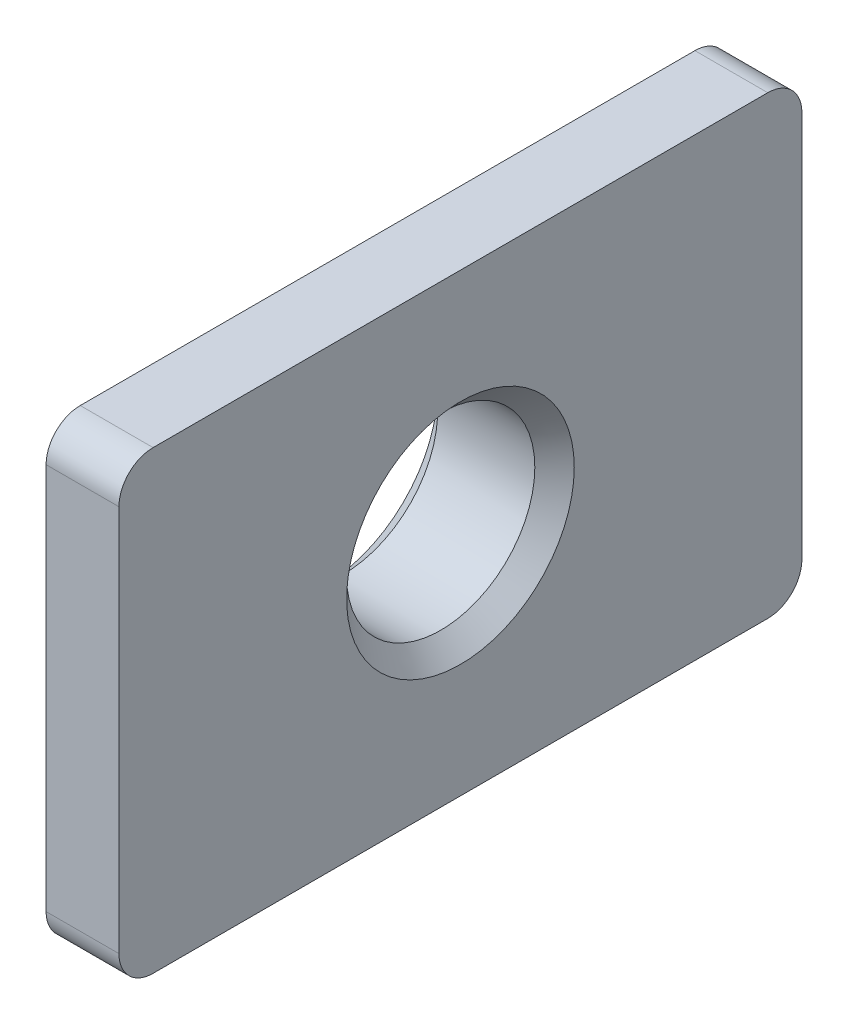
ISO-10303-21;
HEADER;
FILE_DESCRIPTION(('STEP AP214'),'2;1');
FILE_NAME('part.step','',(''),(''),'','','');
FILE_SCHEMA(('AUTOMOTIVE_DESIGN { 1 0 10303 214 1 1 1 1 }'));
ENDSEC;
DATA;
#1=APPLICATION_CONTEXT('core data for automotive mechanical design processes');
#2=APPLICATION_PROTOCOL_DEFINITION('international standard','automotive_design',2000,#1);
#3=PRODUCT_CONTEXT('',#1,'mechanical');
#4=PRODUCT('Part','Part','',(#3));
#5=PRODUCT_RELATED_PRODUCT_CATEGORY('part','',(#4));
#6=PRODUCT_DEFINITION_FORMATION('','',#4);
#7=PRODUCT_DEFINITION_CONTEXT('part definition',#1,'design');
#8=PRODUCT_DEFINITION('design','',#6,#7);
#9=PRODUCT_DEFINITION_SHAPE('','',#8);
#10=(LENGTH_UNIT() NAMED_UNIT(*) SI_UNIT(.MILLI.,.METRE.));
#11=(NAMED_UNIT(*) PLANE_ANGLE_UNIT() SI_UNIT($,.RADIAN.));
#12=(NAMED_UNIT(*) SI_UNIT($,.STERADIAN.) SOLID_ANGLE_UNIT());
#13=UNCERTAINTY_MEASURE_WITH_UNIT(LENGTH_MEASURE(1.E-05),#10,'distance_accuracy_value','');
#14=(GEOMETRIC_REPRESENTATION_CONTEXT(3) GLOBAL_UNCERTAINTY_ASSIGNED_CONTEXT((#13)) GLOBAL_UNIT_ASSIGNED_CONTEXT((#10,
#11,#12)) REPRESENTATION_CONTEXT('',''));
#15=CARTESIAN_POINT('',(0.,0.,0.));
#16=DIRECTION('',(0.,0.,1.));
#17=DIRECTION('',(1.,0.,0.));
#18=AXIS2_PLACEMENT_3D('',#15,#16,#17);
#19=CARTESIAN_POINT('',(-3.,-4.25,6.75));
#20=DIRECTION('',(1.,0.,0.));
#21=DIRECTION('',(0.,0.,-1.));
#22=AXIS2_PLACEMENT_3D('',#19,#20,#21);
#23=PLANE('',#22);
#24=CARTESIAN_POINT('',(-3.,0.,0.));
#25=DIRECTION('',(-1.,0.,0.));
#26=DIRECTION('',(0.,0.,1.));
#27=AXIS2_PLACEMENT_3D('',#24,#25,#26);
#28=CIRCLE('',#27,3.45);
#29=CARTESIAN_POINT('',(-3.,0.,3.45));
#30=VERTEX_POINT('',#29);
#31=EDGE_CURVE('E139',#30,#30,#28,.F.);
#32=ORIENTED_EDGE('',*,*,#31,.F.);
#33=EDGE_LOOP('',(#32));
#34=FACE_BOUND('',#33,.T.);
#35=CARTESIAN_POINT('',(-2.9999999999859,0.,0.));
#36=DIRECTION('',(-1.,0.,0.));
#37=DIRECTION('',(0.,0.,1.));
#38=AXIS2_PLACEMENT_3D('',#35,#36,#37);
#39=CIRCLE('',#38,2.50000000005457);
#40=CARTESIAN_POINT('',(-2.9999999999859,0.,2.50000000005457));
#41=VERTEX_POINT('',#40);
#42=EDGE_CURVE('E19',#41,#41,#39,.F.);
#43=ORIENTED_EDGE('',*,*,#42,.T.);
#44=EDGE_LOOP('',(#43));
#45=FACE_BOUND('',#44,.T.);
#46=ADVANCED_FACE('F16',(#34,#45),#23,.F.);
#47=CARTESIAN_POINT('',(-2.9999999999859,0.,0.));
#48=DIRECTION('',(-1.,0.,0.));
#49=DIRECTION('',(0.,0.,1.));
#50=AXIS2_PLACEMENT_3D('',#47,#48,#49);
#51=CONICAL_SURFACE('',#50,2.50000000005457,0.785398163397448);
#52=ORIENTED_EDGE('',*,*,#42,.F.);
#53=EDGE_LOOP('',(#52));
#54=FACE_BOUND('',#53,.T.);
#55=CARTESIAN_POINT('',(-2.567,0.,0.));
#56=DIRECTION('',(-1.,0.,0.));
#57=DIRECTION('',(0.,0.,1.));
#58=AXIS2_PLACEMENT_3D('',#55,#56,#57);
#59=CIRCLE('',#58,2.067);
#60=CARTESIAN_POINT('',(-2.567,0.,2.067));
#61=VERTEX_POINT('',#60);
#62=EDGE_CURVE('E86',#61,#61,#59,.F.);
#63=ORIENTED_EDGE('',*,*,#62,.T.);
#64=EDGE_LOOP('',(#63));
#65=FACE_BOUND('',#64,.T.);
#66=ADVANCED_FACE('F168',(#54,#65),#51,.F.);
#67=CARTESIAN_POINT('',(3.,0.,0.));
#68=DIRECTION('',(-1.,0.,0.));
#69=DIRECTION('',(0.,0.,1.));
#70=AXIS2_PLACEMENT_3D('',#67,#68,#69);
#71=CYLINDRICAL_SURFACE('',#70,3.45);
#72=ORIENTED_EDGE('',*,*,#31,.T.);
#73=EDGE_LOOP('',(#72));
#74=FACE_BOUND('',#73,.T.);
#75=CARTESIAN_POINT('',(-1.6,0.,0.));
#76=DIRECTION('',(-1.,0.,0.));
#77=DIRECTION('',(0.,0.,1.));
#78=AXIS2_PLACEMENT_3D('',#75,#76,#77);
#79=CIRCLE('',#78,3.45);
#80=CARTESIAN_POINT('',(-1.6,0.,3.45));
#81=VERTEX_POINT('',#80);
#82=EDGE_CURVE('E85',#81,#81,#79,.T.);
#83=ORIENTED_EDGE('',*,*,#82,.T.);
#84=EDGE_LOOP('',(#83));
#85=FACE_BOUND('',#84,.T.);
#86=ADVANCED_FACE('F171',(#74,#85),#71,.T.);
#87=CARTESIAN_POINT('',(0.,0.,0.));
#88=DIRECTION('',(-1.,0.,0.));
#89=DIRECTION('',(0.,0.,1.));
#90=AXIS2_PLACEMENT_3D('',#87,#88,#89);
#91=CYLINDRICAL_SURFACE('',#90,2.067);
#92=ORIENTED_EDGE('',*,*,#62,.F.);
#93=EDGE_LOOP('',(#92));
#94=FACE_BOUND('',#93,.T.);
#95=CARTESIAN_POINT('',(-0.432999999986805,0.,0.));
#96=DIRECTION('',(1.,0.,0.));
#97=DIRECTION('',(0.,0.,-1.));
#98=AXIS2_PLACEMENT_3D('',#95,#96,#97);
#99=CIRCLE('',#98,2.06700000001092);
#100=CARTESIAN_POINT('',(-0.432999999986805,0.,-2.06700000001092));
#101=VERTEX_POINT('',#100);
#102=EDGE_CURVE('E95',#101,#101,#99,.T.);
#103=ORIENTED_EDGE('',*,*,#102,.T.);
#104=EDGE_LOOP('',(#103));
#105=FACE_BOUND('',#104,.T.);
#106=ADVANCED_FACE('F174',(#94,#105),#91,.F.);
#107=CARTESIAN_POINT('',(-1.6,3.45,0.));
#108=DIRECTION('',(1.,0.,0.));
#109=DIRECTION('',(0.,0.,-1.));
#110=AXIS2_PLACEMENT_3D('',#107,#108,#109);
#111=PLANE('',#110);
#112=ORIENTED_EDGE('',*,*,#82,.F.);
#113=EDGE_LOOP('',(#112));
#114=FACE_BOUND('',#113,.T.);
#115=CARTESIAN_POINT('',(-1.6,4.25,-6.75));
#116=DIRECTION('',(-1.,0.,0.));
#117=DIRECTION('',(0.,0.,1.));
#118=AXIS2_PLACEMENT_3D('',#115,#116,#117);
#119=CIRCLE('',#118,0.75);
#120=CARTESIAN_POINT('',(-1.6,4.25,-7.5));
#121=VERTEX_POINT('',#120);
#122=CARTESIAN_POINT('',(-1.6,5.,-6.75));
#123=VERTEX_POINT('',#122);
#124=EDGE_CURVE('E113',#121,#123,#119,.F.);
#125=ORIENTED_EDGE('',*,*,#124,.F.);
#126=DIRECTION('',(0.,1.,0.));
#127=VECTOR('',#126,1.);
#128=CARTESIAN_POINT('',(-1.6,-4.25,-7.5));
#129=LINE('',#128,#127);
#130=CARTESIAN_POINT('',(-1.6,-4.25,-7.5));
#131=VERTEX_POINT('',#130);
#132=EDGE_CURVE('E117',#131,#121,#129,.T.);
#133=ORIENTED_EDGE('',*,*,#132,.F.);
#134=CARTESIAN_POINT('',(-1.6,-4.25,-6.75));
#135=DIRECTION('',(-1.,0.,0.));
#136=DIRECTION('',(0.,0.,1.));
#137=AXIS2_PLACEMENT_3D('',#134,#135,#136);
#138=CIRCLE('',#137,0.75);
#139=CARTESIAN_POINT('',(-1.6,-5.,-6.75));
#140=VERTEX_POINT('',#139);
#141=EDGE_CURVE('E121',#140,#131,#138,.F.);
#142=ORIENTED_EDGE('',*,*,#141,.F.);
#143=DIRECTION('',(0.,0.,-1.));
#144=VECTOR('',#143,1.);
#145=CARTESIAN_POINT('',(-1.6,-5.,6.75));
#146=LINE('',#145,#144);
#147=CARTESIAN_POINT('',(-1.6,-5.,6.75));
#148=VERTEX_POINT('',#147);
#149=EDGE_CURVE('E125',#148,#140,#146,.T.);
#150=ORIENTED_EDGE('',*,*,#149,.F.);
#151=CARTESIAN_POINT('',(-1.6,-4.25,6.75));
#152=DIRECTION('',(-1.,0.,0.));
#153=DIRECTION('',(0.,0.,1.));
#154=AXIS2_PLACEMENT_3D('',#151,#152,#153);
#155=CIRCLE('',#154,0.75);
#156=CARTESIAN_POINT('',(-1.6,-4.25,7.5));
#157=VERTEX_POINT('',#156);
#158=EDGE_CURVE('E92',#157,#148,#155,.F.);
#159=ORIENTED_EDGE('',*,*,#158,.F.);
#160=DIRECTION('',(0.,1.,0.));
#161=VECTOR('',#160,1.);
#162=CARTESIAN_POINT('',(-1.6,4.25,7.5));
#163=LINE('',#162,#161);
#164=CARTESIAN_POINT('',(-1.6,4.25,7.5));
#165=VERTEX_POINT('',#164);
#166=EDGE_CURVE('E89',#165,#157,#163,.F.);
#167=ORIENTED_EDGE('',*,*,#166,.F.);
#168=CARTESIAN_POINT('',(-1.6,4.25,6.75));
#169=DIRECTION('',(-1.,0.,0.));
#170=DIRECTION('',(0.,0.,1.));
#171=AXIS2_PLACEMENT_3D('',#168,#169,#170);
#172=CIRCLE('',#171,0.75);
#173=CARTESIAN_POINT('',(-1.6,5.,6.75));
#174=VERTEX_POINT('',#173);
#175=EDGE_CURVE('E79',#174,#165,#172,.F.);
#176=ORIENTED_EDGE('',*,*,#175,.F.);
#177=DIRECTION('',(0.,0.,1.));
#178=VECTOR('',#177,1.);
#179=CARTESIAN_POINT('',(-1.6,5.,-6.75));
#180=LINE('',#179,#178);
#181=EDGE_CURVE('E105',#123,#174,#180,.T.);
#182=ORIENTED_EDGE('',*,*,#181,.F.);
#183=EDGE_LOOP('',(#125,#133,#142,#150,#159,#167,#176,#182));
#184=FACE_BOUND('',#183,.T.);
#185=ADVANCED_FACE('F90',(#114,#184),#111,.F.);
#186=CARTESIAN_POINT('',(5.6843418860808E-11,0.,0.));
#187=DIRECTION('',(1.,0.,0.));
#188=DIRECTION('',(0.,0.,-1.));
#189=AXIS2_PLACEMENT_3D('',#186,#187,#188);
#190=CONICAL_SURFACE('',#189,2.50000000005457,0.785398163397448);
#191=ORIENTED_EDGE('',*,*,#102,.F.);
#192=EDGE_LOOP('',(#191));
#193=FACE_BOUND('',#192,.T.);
#194=CARTESIAN_POINT('',(0.,0.,0.));
#195=DIRECTION('',(1.,0.,0.));
#196=DIRECTION('',(0.,0.,-1.));
#197=AXIS2_PLACEMENT_3D('',#194,#195,#196);
#198=CIRCLE('',#197,2.49999999999773);
#199=CARTESIAN_POINT('',(0.,0.,-2.49999999999773));
#200=VERTEX_POINT('',#199);
#201=EDGE_CURVE('E102',#200,#200,#198,.F.);
#202=ORIENTED_EDGE('',*,*,#201,.F.);
#203=EDGE_LOOP('',(#202));
#204=FACE_BOUND('',#203,.T.);
#205=ADVANCED_FACE('F180',(#193,#204),#190,.F.);
#206=CARTESIAN_POINT('',(-3.,4.25,7.5));
#207=DIRECTION('',(0.,0.,1.));
#208=DIRECTION('',(1.,0.,0.));
#209=AXIS2_PLACEMENT_3D('',#206,#207,#208);
#210=PLANE('',#209);
#211=DIRECTION('',(0.,1.,0.));
#212=VECTOR('',#211,1.);
#213=CARTESIAN_POINT('',(0.,-4.25,7.5));
#214=LINE('',#213,#212);
#215=CARTESIAN_POINT('',(0.,4.25,7.5));
#216=VERTEX_POINT('',#215);
#217=CARTESIAN_POINT('',(0.,-4.25,7.5));
#218=VERTEX_POINT('',#217);
#219=EDGE_CURVE('E99',#216,#218,#214,.F.);
#220=ORIENTED_EDGE('',*,*,#219,.F.);
#221=DIRECTION('',(-1.,0.,0.));
#222=VECTOR('',#221,1.);
#223=CARTESIAN_POINT('',(-3.,4.25,7.5));
#224=LINE('',#223,#222);
#225=EDGE_CURVE('E84',#165,#216,#224,.F.);
#226=ORIENTED_EDGE('',*,*,#225,.F.);
#227=ORIENTED_EDGE('',*,*,#166,.T.);
#228=DIRECTION('',(-1.,0.,0.));
#229=VECTOR('',#228,1.);
#230=CARTESIAN_POINT('',(-3.,-4.25,7.5));
#231=LINE('',#230,#229);
#232=EDGE_CURVE('E126',#218,#157,#231,.T.);
#233=ORIENTED_EDGE('',*,*,#232,.F.);
#234=EDGE_LOOP('',(#220,#226,#227,#233));
#235=FACE_BOUND('',#234,.T.);
#236=ADVANCED_FACE('F97',(#235),#210,.T.);
#237=CARTESIAN_POINT('',(-3.,-4.25,6.75));
#238=DIRECTION('',(-1.,0.,0.));
#239=DIRECTION('',(0.,0.,1.));
#240=AXIS2_PLACEMENT_3D('',#237,#238,#239);
#241=CYLINDRICAL_SURFACE('',#240,0.75);
#242=CARTESIAN_POINT('',(0.,-4.25,6.75));
#243=DIRECTION('',(-1.,0.,0.));
#244=DIRECTION('',(0.,0.,1.));
#245=AXIS2_PLACEMENT_3D('',#242,#243,#244);
#246=CIRCLE('',#245,0.75);
#247=CARTESIAN_POINT('',(0.,-5.,6.75));
#248=VERTEX_POINT('',#247);
#249=EDGE_CURVE('E150',#218,#248,#246,.F.);
#250=ORIENTED_EDGE('',*,*,#249,.F.);
#251=ORIENTED_EDGE('',*,*,#232,.T.);
#252=ORIENTED_EDGE('',*,*,#158,.T.);
#253=DIRECTION('',(1.,0.,0.));
#254=VECTOR('',#253,1.);
#255=CARTESIAN_POINT('',(-3.,-5.,6.75));
#256=LINE('',#255,#254);
#257=EDGE_CURVE('E122',#248,#148,#256,.F.);
#258=ORIENTED_EDGE('',*,*,#257,.F.);
#259=EDGE_LOOP('',(#250,#251,#252,#258));
#260=FACE_BOUND('',#259,.T.);
#261=ADVANCED_FACE('F215',(#260),#241,.T.);
#262=CARTESIAN_POINT('',(-3.,-5.,6.75));
#263=DIRECTION('',(0.,-1.,0.));
#264=DIRECTION('',(0.,0.,-1.));
#265=AXIS2_PLACEMENT_3D('',#262,#263,#264);
#266=PLANE('',#265);
#267=DIRECTION('',(0.,0.,-1.));
#268=VECTOR('',#267,1.);
#269=CARTESIAN_POINT('',(0.,-5.,6.75));
#270=LINE('',#269,#268);
#271=CARTESIAN_POINT('',(0.,-5.,-6.75));
#272=VERTEX_POINT('',#271);
#273=EDGE_CURVE('E149',#248,#272,#270,.T.);
#274=ORIENTED_EDGE('',*,*,#273,.F.);
#275=ORIENTED_EDGE('',*,*,#257,.T.);
#276=ORIENTED_EDGE('',*,*,#149,.T.);
#277=DIRECTION('',(-1.,0.,0.));
#278=VECTOR('',#277,1.);
#279=CARTESIAN_POINT('',(-3.,-5.,-6.75));
#280=LINE('',#279,#278);
#281=EDGE_CURVE('E118',#272,#140,#280,.T.);
#282=ORIENTED_EDGE('',*,*,#281,.F.);
#283=EDGE_LOOP('',(#274,#275,#276,#282));
#284=FACE_BOUND('',#283,.T.);
#285=ADVANCED_FACE('F211',(#284),#266,.T.);
#286=CARTESIAN_POINT('',(-3.,-4.25,-6.75));
#287=DIRECTION('',(-1.,0.,0.));
#288=DIRECTION('',(0.,0.,1.));
#289=AXIS2_PLACEMENT_3D('',#286,#287,#288);
#290=CYLINDRICAL_SURFACE('',#289,0.75);
#291=CARTESIAN_POINT('',(0.,-4.25,-6.75));
#292=DIRECTION('',(-1.,0.,0.));
#293=DIRECTION('',(0.,0.,1.));
#294=AXIS2_PLACEMENT_3D('',#291,#292,#293);
#295=CIRCLE('',#294,0.75);
#296=CARTESIAN_POINT('',(0.,-4.25,-7.5));
#297=VERTEX_POINT('',#296);
#298=EDGE_CURVE('E146',#272,#297,#295,.F.);
#299=ORIENTED_EDGE('',*,*,#298,.F.);
#300=ORIENTED_EDGE('',*,*,#281,.T.);
#301=ORIENTED_EDGE('',*,*,#141,.T.);
#302=DIRECTION('',(-1.,0.,0.));
#303=VECTOR('',#302,1.);
#304=CARTESIAN_POINT('',(-3.,-4.25,-7.5));
#305=LINE('',#304,#303);
#306=EDGE_CURVE('E114',#297,#131,#305,.T.);
#307=ORIENTED_EDGE('',*,*,#306,.F.);
#308=EDGE_LOOP('',(#299,#300,#301,#307));
#309=FACE_BOUND('',#308,.T.);
#310=ADVANCED_FACE('F207',(#309),#290,.T.);
#311=CARTESIAN_POINT('',(-3.,-4.25,-7.5));
#312=DIRECTION('',(0.,0.,-1.));
#313=DIRECTION('',(-1.,0.,0.));
#314=AXIS2_PLACEMENT_3D('',#311,#312,#313);
#315=PLANE('',#314);
#316=DIRECTION('',(0.,1.,0.));
#317=VECTOR('',#316,1.);
#318=CARTESIAN_POINT('',(0.,-4.25,-7.5));
#319=LINE('',#318,#317);
#320=CARTESIAN_POINT('',(0.,4.25,-7.5));
#321=VERTEX_POINT('',#320);
#322=EDGE_CURVE('E145',#297,#321,#319,.T.);
#323=ORIENTED_EDGE('',*,*,#322,.F.);
#324=ORIENTED_EDGE('',*,*,#306,.T.);
#325=ORIENTED_EDGE('',*,*,#132,.T.);
#326=DIRECTION('',(-1.,0.,0.));
#327=VECTOR('',#326,1.);
#328=CARTESIAN_POINT('',(-3.,4.25,-7.5));
#329=LINE('',#328,#327);
#330=EDGE_CURVE('E110',#321,#121,#329,.T.);
#331=ORIENTED_EDGE('',*,*,#330,.F.);
#332=EDGE_LOOP('',(#323,#324,#325,#331));
#333=FACE_BOUND('',#332,.T.);
#334=ADVANCED_FACE('F203',(#333),#315,.T.);
#335=CARTESIAN_POINT('',(-3.,4.25,-6.75));
#336=DIRECTION('',(-1.,0.,0.));
#337=DIRECTION('',(0.,0.,1.));
#338=AXIS2_PLACEMENT_3D('',#335,#336,#337);
#339=CYLINDRICAL_SURFACE('',#338,0.75);
#340=CARTESIAN_POINT('',(0.,4.25,-6.75));
#341=DIRECTION('',(-1.,0.,0.));
#342=DIRECTION('',(0.,0.,1.));
#343=AXIS2_PLACEMENT_3D('',#340,#341,#342);
#344=CIRCLE('',#343,0.75);
#345=CARTESIAN_POINT('',(0.,5.,-6.75));
#346=VERTEX_POINT('',#345);
#347=EDGE_CURVE('E142',#321,#346,#344,.F.);
#348=ORIENTED_EDGE('',*,*,#347,.F.);
#349=ORIENTED_EDGE('',*,*,#330,.T.);
#350=ORIENTED_EDGE('',*,*,#124,.T.);
#351=DIRECTION('',(1.,0.,0.));
#352=VECTOR('',#351,1.);
#353=CARTESIAN_POINT('',(-3.,5.,-6.75));
#354=LINE('',#353,#352);
#355=EDGE_CURVE('E100',#346,#123,#354,.F.);
#356=ORIENTED_EDGE('',*,*,#355,.F.);
#357=EDGE_LOOP('',(#348,#349,#350,#356));
#358=FACE_BOUND('',#357,.T.);
#359=ADVANCED_FACE('F200',(#358),#339,.T.);
#360=CARTESIAN_POINT('',(-3.,5.,-6.75));
#361=DIRECTION('',(0.,1.,0.));
#362=DIRECTION('',(0.,0.,1.));
#363=AXIS2_PLACEMENT_3D('',#360,#361,#362);
#364=PLANE('',#363);
#365=DIRECTION('',(0.,0.,-1.));
#366=VECTOR('',#365,1.);
#367=CARTESIAN_POINT('',(0.,5.,6.75));
#368=LINE('',#367,#366);
#369=CARTESIAN_POINT('',(0.,5.,6.75));
#370=VERTEX_POINT('',#369);
#371=EDGE_CURVE('E25',#346,#370,#368,.F.);
#372=ORIENTED_EDGE('',*,*,#371,.F.);
#373=ORIENTED_EDGE('',*,*,#355,.T.);
#374=ORIENTED_EDGE('',*,*,#181,.T.);
#375=DIRECTION('',(-1.,0.,0.));
#376=VECTOR('',#375,1.);
#377=CARTESIAN_POINT('',(-3.,5.,6.75));
#378=LINE('',#377,#376);
#379=EDGE_CURVE('E34',#370,#174,#378,.T.);
#380=ORIENTED_EDGE('',*,*,#379,.F.);
#381=EDGE_LOOP('',(#372,#373,#374,#380));
#382=FACE_BOUND('',#381,.T.);
#383=ADVANCED_FACE('F194',(#382),#364,.T.);
#384=CARTESIAN_POINT('',(-3.,4.25,6.75));
#385=DIRECTION('',(-1.,0.,0.));
#386=DIRECTION('',(0.,0.,1.));
#387=AXIS2_PLACEMENT_3D('',#384,#385,#386);
#388=CYLINDRICAL_SURFACE('',#387,0.75);
#389=CARTESIAN_POINT('',(0.,4.25,6.75));
#390=DIRECTION('',(-1.,0.,0.));
#391=DIRECTION('',(0.,0.,1.));
#392=AXIS2_PLACEMENT_3D('',#389,#390,#391);
#393=CIRCLE('',#392,0.75);
#394=EDGE_CURVE('E10',#370,#216,#393,.F.);
#395=ORIENTED_EDGE('',*,*,#394,.F.);
#396=ORIENTED_EDGE('',*,*,#379,.T.);
#397=ORIENTED_EDGE('',*,*,#175,.T.);
#398=ORIENTED_EDGE('',*,*,#225,.T.);
#399=EDGE_LOOP('',(#395,#396,#397,#398));
#400=FACE_BOUND('',#399,.T.);
#401=ADVANCED_FACE('F82',(#400),#388,.T.);
#402=CARTESIAN_POINT('',(0.,-4.25,6.75));
#403=DIRECTION('',(1.,0.,0.));
#404=DIRECTION('',(0.,0.,-1.));
#405=AXIS2_PLACEMENT_3D('',#402,#403,#404);
#406=PLANE('',#405);
#407=ORIENTED_EDGE('',*,*,#371,.T.);
#408=ORIENTED_EDGE('',*,*,#394,.T.);
#409=ORIENTED_EDGE('',*,*,#219,.T.);
#410=ORIENTED_EDGE('',*,*,#249,.T.);
#411=ORIENTED_EDGE('',*,*,#273,.T.);
#412=ORIENTED_EDGE('',*,*,#298,.T.);
#413=ORIENTED_EDGE('',*,*,#322,.T.);
#414=ORIENTED_EDGE('',*,*,#347,.T.);
#415=EDGE_LOOP('',(#407,#408,#409,#410,#411,#412,#413,#414));
#416=FACE_BOUND('',#415,.T.);
#417=ORIENTED_EDGE('',*,*,#201,.T.);
#418=EDGE_LOOP('',(#417));
#419=FACE_BOUND('',#418,.T.);
#420=ADVANCED_FACE('F186',(#416,#419),#406,.T.);
#421=CLOSED_SHELL('',(#46,#66,#86,#106,#185,#205,#236,#261,#285,#310,#334,#359,#383,#401,#420));
#422=MANIFOLD_SOLID_BREP('B1',#421);
#423=ADVANCED_BREP_SHAPE_REPRESENTATION('',(#18,#422),#14);
#424=SHAPE_DEFINITION_REPRESENTATION(#9,#423);
ENDSEC;
END-ISO-10303-21;
